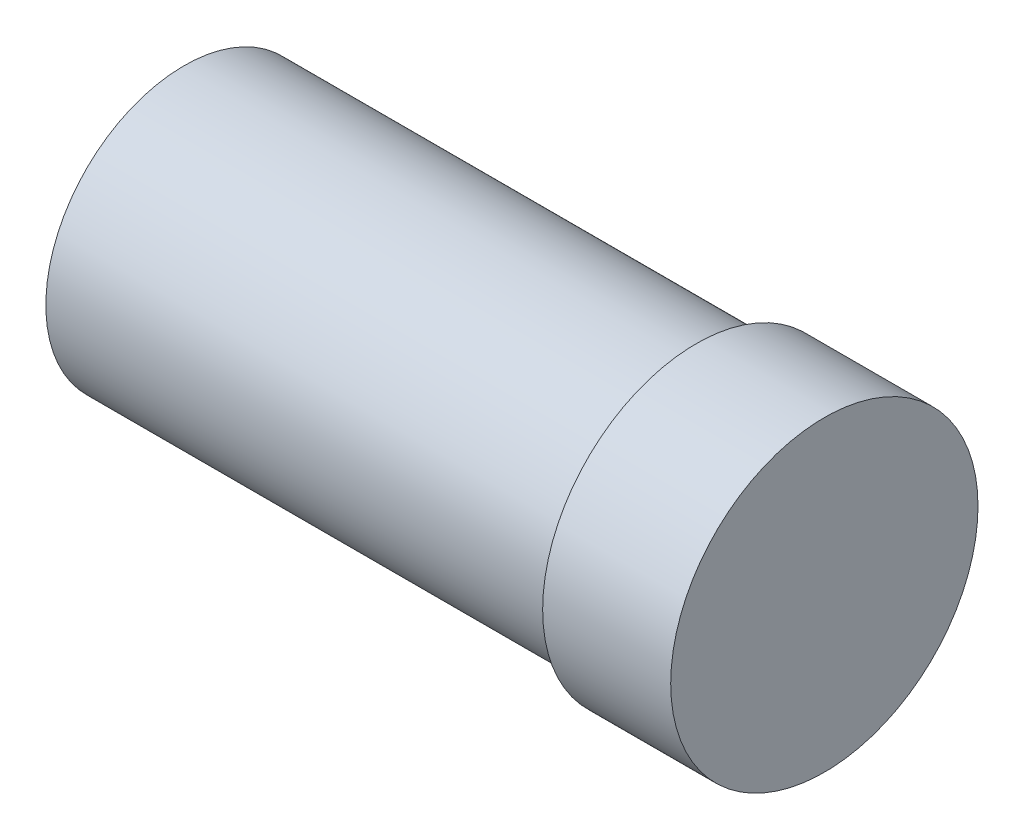
ISO-10303-21;
HEADER;
FILE_DESCRIPTION(('STEP AP214'),'2;1');
FILE_NAME('part.step','',(''),(''),'','','');
FILE_SCHEMA(('AUTOMOTIVE_DESIGN { 1 0 10303 214 1 1 1 1 }'));
ENDSEC;
DATA;
#1=APPLICATION_CONTEXT('core data for automotive mechanical design processes');
#2=APPLICATION_PROTOCOL_DEFINITION('international standard','automotive_design',2000,#1);
#3=PRODUCT_CONTEXT('',#1,'mechanical');
#4=PRODUCT('Part','Part','',(#3));
#5=PRODUCT_RELATED_PRODUCT_CATEGORY('part','',(#4));
#6=PRODUCT_DEFINITION_FORMATION('','',#4);
#7=PRODUCT_DEFINITION_CONTEXT('part definition',#1,'design');
#8=PRODUCT_DEFINITION('design','',#6,#7);
#9=PRODUCT_DEFINITION_SHAPE('','',#8);
#10=(LENGTH_UNIT() NAMED_UNIT(*) SI_UNIT(.MILLI.,.METRE.));
#11=(NAMED_UNIT(*) PLANE_ANGLE_UNIT() SI_UNIT($,.RADIAN.));
#12=(NAMED_UNIT(*) SI_UNIT($,.STERADIAN.) SOLID_ANGLE_UNIT());
#13=UNCERTAINTY_MEASURE_WITH_UNIT(LENGTH_MEASURE(1.E-05),#10,'distance_accuracy_value','');
#14=(GEOMETRIC_REPRESENTATION_CONTEXT(3) GLOBAL_UNCERTAINTY_ASSIGNED_CONTEXT((#13)) GLOBAL_UNIT_ASSIGNED_CONTEXT((#10,
#11,#12)) REPRESENTATION_CONTEXT('',''));
#15=CARTESIAN_POINT('',(0.,0.,0.));
#16=DIRECTION('',(0.,0.,1.));
#17=DIRECTION('',(1.,0.,0.));
#18=AXIS2_PLACEMENT_3D('',#15,#16,#17);
#19=CARTESIAN_POINT('',(100.,0.,0.));
#20=DIRECTION('',(-1.,0.,0.));
#21=DIRECTION('',(0.,0.,1.));
#22=AXIS2_PLACEMENT_3D('',#19,#20,#21);
#23=CYLINDRICAL_SURFACE('',#22,27.);
#24=CARTESIAN_POINT('',(100.,0.,0.));
#25=DIRECTION('',(1.,0.,0.));
#26=DIRECTION('',(0.,0.,-1.));
#27=AXIS2_PLACEMENT_3D('',#24,#25,#26);
#28=CIRCLE('',#27,27.);
#29=CARTESIAN_POINT('',(100.,0.,-27.));
#30=VERTEX_POINT('',#29);
#31=EDGE_CURVE('E10',#30,#30,#28,.T.);
#32=ORIENTED_EDGE('',*,*,#31,.F.);
#33=EDGE_LOOP('',(#32));
#34=FACE_BOUND('',#33,.T.);
#35=CARTESIAN_POINT('',(0.,0.,0.));
#36=DIRECTION('',(1.,0.,0.));
#37=DIRECTION('',(0.,0.,-1.));
#38=AXIS2_PLACEMENT_3D('',#35,#36,#37);
#39=CIRCLE('',#38,27.);
#40=CARTESIAN_POINT('',(0.,0.,-27.));
#41=VERTEX_POINT('',#40);
#42=EDGE_CURVE('E37',#41,#41,#39,.T.);
#43=ORIENTED_EDGE('',*,*,#42,.T.);
#44=EDGE_LOOP('',(#43));
#45=FACE_BOUND('',#44,.T.);
#46=ADVANCED_FACE('F34',(#34,#45),#23,.T.);
#47=CARTESIAN_POINT('',(0.,0.,0.));
#48=DIRECTION('',(1.,0.,0.));
#49=DIRECTION('',(0.,0.,-1.));
#50=AXIS2_PLACEMENT_3D('',#47,#48,#49);
#51=PLANE('',#50);
#52=ORIENTED_EDGE('',*,*,#42,.F.);
#53=EDGE_LOOP('',(#52));
#54=FACE_BOUND('',#53,.T.);
#55=ADVANCED_FACE('F57',(#54),#51,.F.);
#56=CARTESIAN_POINT('',(125.,0.,0.));
#57=DIRECTION('',(-1.,0.,0.));
#58=DIRECTION('',(0.,0.,1.));
#59=AXIS2_PLACEMENT_3D('',#56,#57,#58);
#60=CYLINDRICAL_SURFACE('',#59,30.);
#61=CARTESIAN_POINT('',(125.,0.,0.));
#62=DIRECTION('',(1.,0.,0.));
#63=DIRECTION('',(0.,0.,-1.));
#64=AXIS2_PLACEMENT_3D('',#61,#62,#63);
#65=CIRCLE('',#64,30.);
#66=CARTESIAN_POINT('',(125.,0.,-30.));
#67=VERTEX_POINT('',#66);
#68=EDGE_CURVE('E44',#67,#67,#65,.T.);
#69=ORIENTED_EDGE('',*,*,#68,.F.);
#70=EDGE_LOOP('',(#69));
#71=FACE_BOUND('',#70,.T.);
#72=CARTESIAN_POINT('',(100.,0.,0.));
#73=DIRECTION('',(1.,0.,0.));
#74=DIRECTION('',(0.,0.,-1.));
#75=AXIS2_PLACEMENT_3D('',#72,#73,#74);
#76=CIRCLE('',#75,30.);
#77=CARTESIAN_POINT('',(100.,0.,-30.));
#78=VERTEX_POINT('',#77);
#79=EDGE_CURVE('E46',#78,#78,#76,.T.);
#80=ORIENTED_EDGE('',*,*,#79,.T.);
#81=EDGE_LOOP('',(#80));
#82=FACE_BOUND('',#81,.T.);
#83=ADVANCED_FACE('F54',(#71,#82),#60,.T.);
#84=CARTESIAN_POINT('',(125.,0.,0.));
#85=DIRECTION('',(1.,0.,0.));
#86=DIRECTION('',(0.,0.,-1.));
#87=AXIS2_PLACEMENT_3D('',#84,#85,#86);
#88=PLANE('',#87);
#89=ORIENTED_EDGE('',*,*,#68,.T.);
#90=EDGE_LOOP('',(#89));
#91=FACE_BOUND('',#90,.T.);
#92=ADVANCED_FACE('F52',(#91),#88,.T.);
#93=CARTESIAN_POINT('',(100.,0.,0.));
#94=DIRECTION('',(1.,0.,0.));
#95=DIRECTION('',(0.,0.,-1.));
#96=AXIS2_PLACEMENT_3D('',#93,#94,#95);
#97=PLANE('',#96);
#98=ORIENTED_EDGE('',*,*,#31,.T.);
#99=EDGE_LOOP('',(#98));
#100=FACE_BOUND('',#99,.T.);
#101=ORIENTED_EDGE('',*,*,#79,.F.);
#102=EDGE_LOOP('',(#101));
#103=FACE_BOUND('',#102,.T.);
#104=ADVANCED_FACE('F61',(#100,#103),#97,.F.);
#105=CLOSED_SHELL('',(#46,#55,#83,#92,#104));
#106=MANIFOLD_SOLID_BREP('B2',#105);
#107=ADVANCED_BREP_SHAPE_REPRESENTATION('',(#18,#106),#14);
#108=SHAPE_DEFINITION_REPRESENTATION(#9,#107);
ENDSEC;
END-ISO-10303-21;
